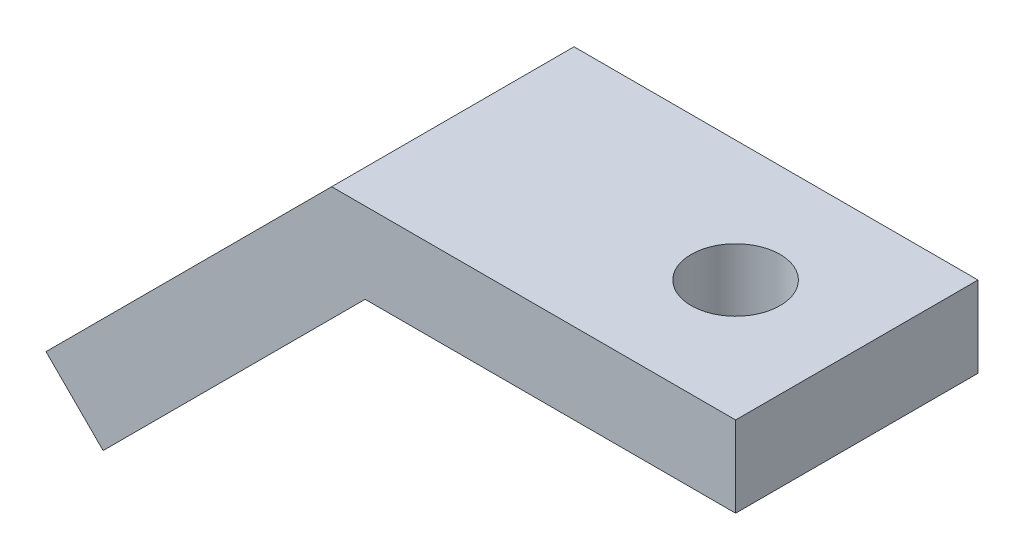
ISO-10303-21;
HEADER;
FILE_DESCRIPTION(('STEP AP214'),'2;1');
FILE_NAME('part.step','',(''),(''),'','','');
FILE_SCHEMA(('AUTOMOTIVE_DESIGN { 1 0 10303 214 1 1 1 1 }'));
ENDSEC;
DATA;
#1=APPLICATION_CONTEXT('core data for automotive mechanical design processes');
#2=APPLICATION_PROTOCOL_DEFINITION('international standard','automotive_design',2000,#1);
#3=PRODUCT_CONTEXT('',#1,'mechanical');
#4=PRODUCT('Part','Part','',(#3));
#5=PRODUCT_RELATED_PRODUCT_CATEGORY('part','',(#4));
#6=PRODUCT_DEFINITION_FORMATION('','',#4);
#7=PRODUCT_DEFINITION_CONTEXT('part definition',#1,'design');
#8=PRODUCT_DEFINITION('design','',#6,#7);
#9=PRODUCT_DEFINITION_SHAPE('','',#8);
#10=(LENGTH_UNIT() NAMED_UNIT(*) SI_UNIT(.MILLI.,.METRE.));
#11=(NAMED_UNIT(*) PLANE_ANGLE_UNIT() SI_UNIT($,.RADIAN.));
#12=(NAMED_UNIT(*) SI_UNIT($,.STERADIAN.) SOLID_ANGLE_UNIT());
#13=UNCERTAINTY_MEASURE_WITH_UNIT(LENGTH_MEASURE(1.E-05),#10,'distance_accuracy_value','');
#14=(GEOMETRIC_REPRESENTATION_CONTEXT(3) GLOBAL_UNCERTAINTY_ASSIGNED_CONTEXT((#13)) GLOBAL_UNIT_ASSIGNED_CONTEXT((#10,
#11,#12)) REPRESENTATION_CONTEXT('',''));
#15=CARTESIAN_POINT('',(0.,0.,0.));
#16=DIRECTION('',(0.,0.,1.));
#17=DIRECTION('',(1.,0.,0.));
#18=AXIS2_PLACEMENT_3D('',#15,#16,#17);
#19=CARTESIAN_POINT('',(8.69888325543363,2.39042593884301,6.));
#20=DIRECTION('',(-1.,0.,0.));
#21=DIRECTION('',(0.,-1.,0.));
#22=AXIS2_PLACEMENT_3D('',#19,#20,#21);
#23=PLANE('',#22);
#24=DIRECTION('',(0.,1.,0.));
#25=VECTOR('',#24,1.);
#26=CARTESIAN_POINT('',(8.69888325543363,2.39042593884301,0.));
#27=LINE('',#26,#25);
#28=CARTESIAN_POINT('',(8.69888325543363,2.39042593884301,0.));
#29=VERTEX_POINT('',#28);
#30=CARTESIAN_POINT('',(8.69888325543363,4.39042593884301,0.));
#31=VERTEX_POINT('',#30);
#32=EDGE_CURVE('E129',#29,#31,#27,.T.);
#33=ORIENTED_EDGE('',*,*,#32,.T.);
#34=DIRECTION('',(0.,0.,-1.));
#35=VECTOR('',#34,1.);
#36=CARTESIAN_POINT('',(8.69888325543363,4.39042593884301,6.));
#37=LINE('',#36,#35);
#38=CARTESIAN_POINT('',(8.69888325543363,4.39042593884301,6.));
#39=VERTEX_POINT('',#38);
#40=EDGE_CURVE('E11',#39,#31,#37,.T.);
#41=ORIENTED_EDGE('',*,*,#40,.F.);
#42=DIRECTION('',(0.,1.,0.));
#43=VECTOR('',#42,1.);
#44=CARTESIAN_POINT('',(8.69888325543363,2.39042593884301,6.));
#45=LINE('',#44,#43);
#46=CARTESIAN_POINT('',(8.69888325543363,2.39042593884301,6.));
#47=VERTEX_POINT('',#46);
#48=EDGE_CURVE('E146',#47,#39,#45,.T.);
#49=ORIENTED_EDGE('',*,*,#48,.F.);
#50=DIRECTION('',(0.,0.,-1.));
#51=VECTOR('',#50,1.);
#52=CARTESIAN_POINT('',(8.69888325543363,2.39042593884301,6.));
#53=LINE('',#52,#51);
#54=EDGE_CURVE('E125',#47,#29,#53,.T.);
#55=ORIENTED_EDGE('',*,*,#54,.T.);
#56=EDGE_LOOP('',(#33,#41,#49,#55));
#57=FACE_BOUND('',#56,.T.);
#58=ADVANCED_FACE('F38',(#57),#23,.F.);
#59=CARTESIAN_POINT('',(8.69888325543363,4.39042593884301,6.));
#60=DIRECTION('',(0.,-1.,0.));
#61=DIRECTION('',(1.,0.,0.));
#62=AXIS2_PLACEMENT_3D('',#59,#60,#61);
#63=PLANE('',#62);
#64=CARTESIAN_POINT('',(5.69888325543363,4.39042593884301,3.));
#65=DIRECTION('',(0.,1.,0.));
#66=DIRECTION('',(-1.,0.,0.));
#67=AXIS2_PLACEMENT_3D('',#64,#65,#66);
#68=CIRCLE('',#67,1.1);
#69=CARTESIAN_POINT('',(4.59888325543363,4.39042593884301,3.));
#70=VERTEX_POINT('',#69);
#71=EDGE_CURVE('E157',#70,#70,#68,.T.);
#72=ORIENTED_EDGE('',*,*,#71,.F.);
#73=EDGE_LOOP('',(#72));
#74=FACE_BOUND('',#73,.T.);
#75=DIRECTION('',(-1.,0.,0.));
#76=VECTOR('',#75,1.);
#77=CARTESIAN_POINT('',(8.69888325543363,4.39042593884301,0.));
#78=LINE('',#77,#76);
#79=CARTESIAN_POINT('',(-1.30111674456637,4.39042593884301,0.));
#80=VERTEX_POINT('',#79);
#81=EDGE_CURVE('E133',#31,#80,#78,.T.);
#82=ORIENTED_EDGE('',*,*,#81,.T.);
#83=DIRECTION('',(0.,0.,-1.));
#84=VECTOR('',#83,1.);
#85=CARTESIAN_POINT('',(-1.30111674456637,4.39042593884301,6.));
#86=LINE('',#85,#84);
#87=CARTESIAN_POINT('',(-1.30111674456637,4.39042593884301,6.));
#88=VERTEX_POINT('',#87);
#89=EDGE_CURVE('E48',#88,#80,#86,.T.);
#90=ORIENTED_EDGE('',*,*,#89,.F.);
#91=DIRECTION('',(-1.,0.,0.));
#92=VECTOR('',#91,1.);
#93=CARTESIAN_POINT('',(8.69888325543363,4.39042593884301,6.));
#94=LINE('',#93,#92);
#95=EDGE_CURVE('E94',#39,#88,#94,.T.);
#96=ORIENTED_EDGE('',*,*,#95,.F.);
#97=ORIENTED_EDGE('',*,*,#40,.T.);
#98=EDGE_LOOP('',(#82,#90,#96,#97));
#99=FACE_BOUND('',#98,.T.);
#100=ADVANCED_FACE('F176',(#74,#99),#63,.F.);
#101=CARTESIAN_POINT('',(-1.30111674456637,4.39042593884301,6.));
#102=DIRECTION('',(0.707106781186549,-0.707106781186546,0.));
#103=DIRECTION('',(0.707106781186546,0.707106781186549,0.));
#104=AXIS2_PLACEMENT_3D('',#101,#102,#103);
#105=PLANE('',#104);
#106=CARTESIAN_POINT('',(-6.25086421287219,-0.559321529462829,3.));
#107=DIRECTION('',(-0.707106781186549,0.707106781186546,0.));
#108=DIRECTION('',(-0.707106781186546,-0.707106781186549,0.));
#109=AXIS2_PLACEMENT_3D('',#106,#107,#108);
#110=CIRCLE('',#109,1.1);
#111=CARTESIAN_POINT('',(-7.0286816721774,-1.33713898876803,3.));
#112=VERTEX_POINT('',#111);
#113=EDGE_CURVE('E167',#112,#112,#110,.T.);
#114=ORIENTED_EDGE('',*,*,#113,.F.);
#115=EDGE_LOOP('',(#114));
#116=FACE_BOUND('',#115,.T.);
#117=DIRECTION('',(-0.707106781186546,-0.707106781186549,0.));
#118=VECTOR('',#117,1.);
#119=CARTESIAN_POINT('',(-1.30111674456637,4.39042593884301,0.));
#120=LINE('',#119,#118);
#121=CARTESIAN_POINT('',(-8.37218455643183,-2.68064187302248,0.));
#122=VERTEX_POINT('',#121);
#123=EDGE_CURVE('E137',#80,#122,#120,.T.);
#124=ORIENTED_EDGE('',*,*,#123,.T.);
#125=DIRECTION('',(0.,0.,-1.));
#126=VECTOR('',#125,1.);
#127=CARTESIAN_POINT('',(-8.37218455643183,-2.68064187302248,6.));
#128=LINE('',#127,#126);
#129=CARTESIAN_POINT('',(-8.37218455643183,-2.68064187302248,6.));
#130=VERTEX_POINT('',#129);
#131=EDGE_CURVE('E118',#130,#122,#128,.T.);
#132=ORIENTED_EDGE('',*,*,#131,.F.);
#133=DIRECTION('',(-0.707106781186546,-0.707106781186549,0.));
#134=VECTOR('',#133,1.);
#135=CARTESIAN_POINT('',(-1.30111674456637,4.39042593884301,6.));
#136=LINE('',#135,#134);
#137=EDGE_CURVE('E107',#88,#130,#136,.T.);
#138=ORIENTED_EDGE('',*,*,#137,.F.);
#139=ORIENTED_EDGE('',*,*,#89,.T.);
#140=EDGE_LOOP('',(#124,#132,#138,#139));
#141=FACE_BOUND('',#140,.T.);
#142=ADVANCED_FACE('F179',(#116,#141),#105,.F.);
#143=CARTESIAN_POINT('',(-8.37218455643183,-2.68064187302248,6.));
#144=DIRECTION('',(0.707106781186546,0.707106781186549,0.));
#145=DIRECTION('',(-0.707106781186549,0.707106781186546,0.));
#146=AXIS2_PLACEMENT_3D('',#143,#144,#145);
#147=PLANE('',#146);
#148=DIRECTION('',(0.707106781186549,-0.707106781186546,0.));
#149=VECTOR('',#148,1.);
#150=CARTESIAN_POINT('',(-8.37218455643183,-2.68064187302248,0.));
#151=LINE('',#150,#149);
#152=CARTESIAN_POINT('',(-6.95797099405873,-4.09485543539557,0.));
#153=VERTEX_POINT('',#152);
#154=EDGE_CURVE('E116',#122,#153,#151,.T.);
#155=ORIENTED_EDGE('',*,*,#154,.T.);
#156=DIRECTION('',(0.,0.,-1.));
#157=VECTOR('',#156,1.);
#158=CARTESIAN_POINT('',(-6.95797099405873,-4.09485543539557,6.));
#159=LINE('',#158,#157);
#160=CARTESIAN_POINT('',(-6.95797099405873,-4.09485543539557,6.));
#161=VERTEX_POINT('',#160);
#162=EDGE_CURVE('E113',#161,#153,#159,.T.);
#163=ORIENTED_EDGE('',*,*,#162,.F.);
#164=DIRECTION('',(0.707106781186549,-0.707106781186546,0.));
#165=VECTOR('',#164,1.);
#166=CARTESIAN_POINT('',(-8.37218455643183,-2.68064187302248,6.));
#167=LINE('',#166,#165);
#168=EDGE_CURVE('E101',#130,#161,#167,.T.);
#169=ORIENTED_EDGE('',*,*,#168,.F.);
#170=ORIENTED_EDGE('',*,*,#131,.T.);
#171=EDGE_LOOP('',(#155,#163,#169,#170));
#172=FACE_BOUND('',#171,.T.);
#173=ADVANCED_FACE('F114',(#172),#147,.F.);
#174=CARTESIAN_POINT('',(-6.95797099405873,-4.09485543539557,6.));
#175=DIRECTION('',(-0.707106781186549,0.707106781186546,0.));
#176=DIRECTION('',(-0.707106781186546,-0.707106781186549,0.));
#177=AXIS2_PLACEMENT_3D('',#174,#175,#176);
#178=PLANE('',#177);
#179=CARTESIAN_POINT('',(-4.8366506504991,-1.97353509183592,3.));
#180=DIRECTION('',(-0.707106781186549,0.707106781186546,0.));
#181=DIRECTION('',(-0.707106781186546,-0.707106781186549,0.));
#182=AXIS2_PLACEMENT_3D('',#179,#180,#181);
#183=CIRCLE('',#182,1.1);
#184=CARTESIAN_POINT('',(-5.6144681098043,-2.75135255114113,3.));
#185=VERTEX_POINT('',#184);
#186=EDGE_CURVE('E41',#185,#185,#183,.T.);
#187=ORIENTED_EDGE('',*,*,#186,.T.);
#188=EDGE_LOOP('',(#187));
#189=FACE_BOUND('',#188,.T.);
#190=DIRECTION('',(0.707106781186546,0.707106781186549,0.));
#191=VECTOR('',#190,1.);
#192=CARTESIAN_POINT('',(-6.95797099405873,-4.09485543539557,0.));
#193=LINE('',#192,#191);
#194=CARTESIAN_POINT('',(-0.472689619820182,2.39042593884301,0.));
#195=VERTEX_POINT('',#194);
#196=EDGE_CURVE('E80',#153,#195,#193,.T.);
#197=ORIENTED_EDGE('',*,*,#196,.T.);
#198=DIRECTION('',(0.,0.,-1.));
#199=VECTOR('',#198,1.);
#200=CARTESIAN_POINT('',(-0.472689619820182,2.39042593884301,6.));
#201=LINE('',#200,#199);
#202=CARTESIAN_POINT('',(-0.472689619820182,2.39042593884301,6.));
#203=VERTEX_POINT('',#202);
#204=EDGE_CURVE('E119',#203,#195,#201,.T.);
#205=ORIENTED_EDGE('',*,*,#204,.F.);
#206=DIRECTION('',(0.707106781186546,0.707106781186549,0.));
#207=VECTOR('',#206,1.);
#208=CARTESIAN_POINT('',(-6.95797099405873,-4.09485543539557,6.));
#209=LINE('',#208,#207);
#210=EDGE_CURVE('E105',#161,#203,#209,.T.);
#211=ORIENTED_EDGE('',*,*,#210,.F.);
#212=ORIENTED_EDGE('',*,*,#162,.T.);
#213=EDGE_LOOP('',(#197,#205,#211,#212));
#214=FACE_BOUND('',#213,.T.);
#215=ADVANCED_FACE('F121',(#189,#214),#178,.F.);
#216=CARTESIAN_POINT('',(-0.472689619820182,2.39042593884301,6.));
#217=DIRECTION('',(0.,1.,0.));
#218=DIRECTION('',(0.,0.,1.));
#219=AXIS2_PLACEMENT_3D('',#216,#217,#218);
#220=PLANE('',#219);
#221=CARTESIAN_POINT('',(5.69888325543363,2.39042593884301,3.));
#222=DIRECTION('',(0.,1.,0.));
#223=DIRECTION('',(0.,0.,1.));
#224=AXIS2_PLACEMENT_3D('',#221,#222,#223);
#225=CIRCLE('',#224,1.1);
#226=CARTESIAN_POINT('',(5.69888325543363,2.39042593884301,4.1));
#227=VERTEX_POINT('',#226);
#228=EDGE_CURVE('E134',#227,#227,#225,.T.);
#229=ORIENTED_EDGE('',*,*,#228,.T.);
#230=EDGE_LOOP('',(#229));
#231=FACE_BOUND('',#230,.T.);
#232=DIRECTION('',(1.,0.,0.));
#233=VECTOR('',#232,1.);
#234=CARTESIAN_POINT('',(-0.472689619820182,2.39042593884301,0.));
#235=LINE('',#234,#233);
#236=EDGE_CURVE('E86',#195,#29,#235,.T.);
#237=ORIENTED_EDGE('',*,*,#236,.T.);
#238=ORIENTED_EDGE('',*,*,#54,.F.);
#239=DIRECTION('',(1.,0.,0.));
#240=VECTOR('',#239,1.);
#241=CARTESIAN_POINT('',(-0.472689619820182,2.39042593884301,6.));
#242=LINE('',#241,#240);
#243=EDGE_CURVE('E57',#203,#47,#242,.T.);
#244=ORIENTED_EDGE('',*,*,#243,.F.);
#245=ORIENTED_EDGE('',*,*,#204,.T.);
#246=EDGE_LOOP('',(#237,#238,#244,#245));
#247=FACE_BOUND('',#246,.T.);
#248=ADVANCED_FACE('F184',(#231,#247),#220,.F.);
#249=CARTESIAN_POINT('',(0.,0.,6.));
#250=DIRECTION('',(0.,0.,1.));
#251=DIRECTION('',(1.,0.,0.));
#252=AXIS2_PLACEMENT_3D('',#249,#250,#251);
#253=PLANE('',#252);
#254=ORIENTED_EDGE('',*,*,#48,.T.);
#255=ORIENTED_EDGE('',*,*,#95,.T.);
#256=ORIENTED_EDGE('',*,*,#137,.T.);
#257=ORIENTED_EDGE('',*,*,#168,.T.);
#258=ORIENTED_EDGE('',*,*,#210,.T.);
#259=ORIENTED_EDGE('',*,*,#243,.T.);
#260=EDGE_LOOP('',(#254,#255,#256,#257,#258,#259));
#261=FACE_BOUND('',#260,.T.);
#262=ADVANCED_FACE('F103',(#261),#253,.T.);
#263=CARTESIAN_POINT('',(0.,0.,0.));
#264=DIRECTION('',(0.,0.,1.));
#265=DIRECTION('',(1.,0.,0.));
#266=AXIS2_PLACEMENT_3D('',#263,#264,#265);
#267=PLANE('',#266);
#268=ORIENTED_EDGE('',*,*,#32,.F.);
#269=ORIENTED_EDGE('',*,*,#236,.F.);
#270=ORIENTED_EDGE('',*,*,#196,.F.);
#271=ORIENTED_EDGE('',*,*,#154,.F.);
#272=ORIENTED_EDGE('',*,*,#123,.F.);
#273=ORIENTED_EDGE('',*,*,#81,.F.);
#274=EDGE_LOOP('',(#268,#269,#270,#271,#272,#273));
#275=FACE_BOUND('',#274,.T.);
#276=ADVANCED_FACE('F182',(#275),#267,.F.);
#277=CARTESIAN_POINT('',(5.69888325543363,-1.60957406115699,3.));
#278=DIRECTION('',(0.,1.,0.));
#279=DIRECTION('',(-1.,0.,0.));
#280=AXIS2_PLACEMENT_3D('',#277,#278,#279);
#281=CYLINDRICAL_SURFACE('',#280,1.1);
#282=ORIENTED_EDGE('',*,*,#71,.T.);
#283=EDGE_LOOP('',(#282));
#284=FACE_BOUND('',#283,.T.);
#285=ORIENTED_EDGE('',*,*,#228,.F.);
#286=EDGE_LOOP('',(#285));
#287=FACE_BOUND('',#286,.T.);
#288=ADVANCED_FACE('F234',(#284,#287),#281,.F.);
#289=CARTESIAN_POINT('',(-2.0082235257529,-4.80196221658211,3.));
#290=DIRECTION('',(-0.707106781186549,0.707106781186546,0.));
#291=DIRECTION('',(-0.707106781186546,-0.707106781186549,0.));
#292=AXIS2_PLACEMENT_3D('',#289,#290,#291);
#293=CYLINDRICAL_SURFACE('',#292,1.1);
#294=CARTESIAN_POINT('',(-7.0286816721774,-1.33713898876803,3.));
#295=CARTESIAN_POINT('',(-7.01395028090268,-1.35187038004275,3.));
#296=CARTESIAN_POINT('',(-6.99921888962796,-1.36660177131747,3.));
#297=CARTESIAN_POINT('',(-6.96975610707852,-1.39606455386691,3.));
#298=CARTESIAN_POINT('',(-6.9550247158038,-1.41079594514163,3.));
#299=CARTESIAN_POINT('',(-6.92556193325436,-1.44025872769107,3.));
#300=CARTESIAN_POINT('',(-6.91083054197964,-1.45499011896579,3.));
#301=CARTESIAN_POINT('',(-6.8813677594302,-1.48445290151523,3.));
#302=CARTESIAN_POINT('',(-6.86663636815548,-1.49918429278995,3.));
#303=CARTESIAN_POINT('',(-6.83717358560604,-1.52864707533939,3.));
#304=CARTESIAN_POINT('',(-6.82244219433132,-1.54337846661411,3.));
#305=CARTESIAN_POINT('',(-6.79297941178188,-1.57284124916355,3.));
#306=CARTESIAN_POINT('',(-6.77824802050716,-1.58757264043827,3.));
#307=CARTESIAN_POINT('',(-6.74878523795772,-1.61703542298771,3.));
#308=CARTESIAN_POINT('',(-6.734053846683,-1.63176681426243,3.));
#309=CARTESIAN_POINT('',(-6.70459106413356,-1.66122959681187,3.));
#310=CARTESIAN_POINT('',(-6.68985967285884,-1.67596098808659,3.));
#311=CARTESIAN_POINT('',(-6.6603968903094,-1.70542377063603,3.));
#312=CARTESIAN_POINT('',(-6.64566549903468,-1.72015516191075,3.));
#313=CARTESIAN_POINT('',(-6.61620271648524,-1.74961794446018,3.));
#314=CARTESIAN_POINT('',(-6.60147132521052,-1.7643493357349,3.));
#315=CARTESIAN_POINT('',(-6.57200854266108,-1.79381211828434,3.));
#316=CARTESIAN_POINT('',(-6.55727715138636,-1.80854350955906,3.));
#317=CARTESIAN_POINT('',(-6.52781436883692,-1.8380062921085,3.));
#318=CARTESIAN_POINT('',(-6.5130829775622,-1.85273768338322,3.));
#319=CARTESIAN_POINT('',(-6.48362019501276,-1.88220046593266,3.));
#320=CARTESIAN_POINT('',(-6.46888880373804,-1.89693185720738,3.));
#321=CARTESIAN_POINT('',(-6.4394260211886,-1.92639463975682,3.));
#322=CARTESIAN_POINT('',(-6.42469462991389,-1.94112603103154,3.));
#323=CARTESIAN_POINT('',(-6.39523184736445,-1.97058881358098,3.));
#324=CARTESIAN_POINT('',(-6.38050045608973,-1.9853202048557,3.));
#325=CARTESIAN_POINT('',(-6.35103767354029,-2.01478298740514,3.));
#326=CARTESIAN_POINT('',(-6.33630628226557,-2.02951437867986,3.));
#327=CARTESIAN_POINT('',(-6.30684349971613,-2.0589771612293,3.));
#328=CARTESIAN_POINT('',(-6.29211210844141,-2.07370855250402,3.));
#329=CARTESIAN_POINT('',(-6.26264932589197,-2.10317133505346,3.));
#330=CARTESIAN_POINT('',(-6.24791793461725,-2.11790272632818,3.));
#331=CARTESIAN_POINT('',(-6.21845515206781,-2.14736550887762,3.));
#332=CARTESIAN_POINT('',(-6.20372376079309,-2.16209690015234,3.));
#333=CARTESIAN_POINT('',(-6.17426097824365,-2.19155968270178,3.));
#334=CARTESIAN_POINT('',(-6.15952958696893,-2.2062910739765,3.));
#335=CARTESIAN_POINT('',(-6.13006680441949,-2.23575385652594,3.));
#336=CARTESIAN_POINT('',(-6.11533541314477,-2.25048524780066,3.));
#337=CARTESIAN_POINT('',(-6.08587263059533,-2.27994803035009,3.));
#338=CARTESIAN_POINT('',(-6.07114123932061,-2.29467942162481,3.));
#339=CARTESIAN_POINT('',(-6.04167845677117,-2.32414220417425,3.));
#340=CARTESIAN_POINT('',(-6.02694706549645,-2.33887359544897,3.));
#341=CARTESIAN_POINT('',(-5.99748428294701,-2.36833637799841,3.));
#342=CARTESIAN_POINT('',(-5.98275289167229,-2.38306776927313,3.));
#343=CARTESIAN_POINT('',(-5.95329010912285,-2.41253055182257,3.));
#344=CARTESIAN_POINT('',(-5.93855871784813,-2.42726194309729,3.));
#345=CARTESIAN_POINT('',(-5.90909593529869,-2.45672472564673,3.));
#346=CARTESIAN_POINT('',(-5.89436454402397,-2.47145611692145,3.));
#347=CARTESIAN_POINT('',(-5.86490176147453,-2.50091889947089,3.));
#348=CARTESIAN_POINT('',(-5.85017037019981,-2.51565029074561,3.));
#349=CARTESIAN_POINT('',(-5.82070758765037,-2.54511307329505,3.));
#350=CARTESIAN_POINT('',(-5.80597619637565,-2.55984446456977,3.));
#351=CARTESIAN_POINT('',(-5.77651341382622,-2.58930724711921,3.));
#352=CARTESIAN_POINT('',(-5.7617820225515,-2.60403863839393,3.));
#353=CARTESIAN_POINT('',(-5.73231924000206,-2.63350142094337,3.));
#354=CARTESIAN_POINT('',(-5.71758784872734,-2.64823281221809,3.));
#355=CARTESIAN_POINT('',(-5.6881250661779,-2.67769559476753,3.));
#356=CARTESIAN_POINT('',(-5.67339367490318,-2.69242698604225,3.));
#357=CARTESIAN_POINT('',(-5.64393089235374,-2.72188976859169,3.));
#358=CARTESIAN_POINT('',(-5.62919950107902,-2.73662115986641,3.));
#359=CARTESIAN_POINT('',(-5.6144681098043,-2.75135255114113,3.));
#360=B_SPLINE_CURVE_WITH_KNOTS('',3,(#294,#295,#296,#297,#298,#299,#300,#301,#302,#303,#304,
#305,#306,#307,#308,#309,#310,#311,#312,#313,#314,#315,#316,#317,#318,#319,#320,#321,#322,#323,
#324,#325,#326,#327,#328,#329,#330,#331,#332,#333,#334,#335,#336,#337,#338,#339,#340,#341,#342,
#343,#344,#345,#346,#347,#348,#349,#350,#351,#352,#353,#354,#355,#356,#357,#358,#359),
.UNSPECIFIED.,.F.,.F.,(4,2,2,2,2,2,2,2,2,2,2,2,2,2,2,2,2,2,2,2,2,2,2,2,2,2,2,2,2,2,2,2,4),(0.,
0.0625000000000004,0.125,0.1875,0.25,0.3125,0.375,0.4375,0.5,0.5625,0.625,0.687499999999999,
0.75,0.8125,0.875,0.9375,0.999999999999999,1.0625,1.125,1.1875,1.25,1.3125,1.375,1.4375,1.5,
1.5625,1.625,1.6875,1.75,1.8125,1.875,1.9375,2.),.UNSPECIFIED.);
#361=EDGE_CURVE('BSEAM239',#112,#185,#360,.T.);
#362=ORIENTED_EDGE('',*,*,#113,.T.);
#363=ORIENTED_EDGE('',*,*,#186,.F.);
#364=ORIENTED_EDGE('',*,*,#361,.T.);
#365=ORIENTED_EDGE('',*,*,#361,.F.);
#366=EDGE_LOOP('',(#362,#364,#363,#365));
#367=FACE_BOUND('',#366,.T.);
#368=ADVANCED_FACE('F239',(#367),#293,.F.);
#369=CLOSED_SHELL('',(#58,#100,#142,#173,#215,#248,#262,#276,#288,#368));
#370=MANIFOLD_SOLID_BREP('B2',#369);
#371=ADVANCED_BREP_SHAPE_REPRESENTATION('',(#18,#370),#14);
#372=SHAPE_DEFINITION_REPRESENTATION(#9,#371);
ENDSEC;
END-ISO-10303-21;
